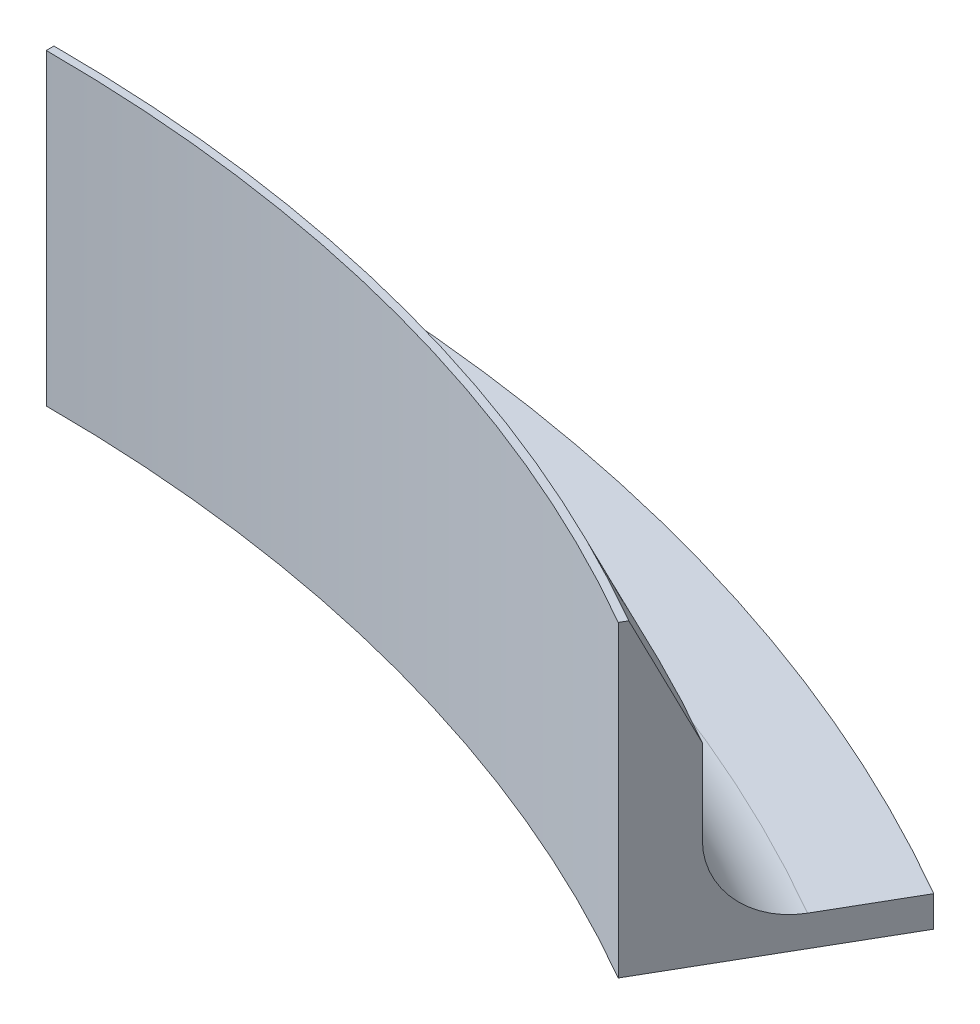
ISO-10303-21;
HEADER;
FILE_DESCRIPTION(('STEP AP214'),'2;1');
FILE_NAME('part.step','',(''),(''),'','','');
FILE_SCHEMA(('AUTOMOTIVE_DESIGN { 1 0 10303 214 1 1 1 1 }'));
ENDSEC;
DATA;
#1=APPLICATION_CONTEXT('core data for automotive mechanical design processes');
#2=APPLICATION_PROTOCOL_DEFINITION('international standard','automotive_design',2000,#1);
#3=PRODUCT_CONTEXT('',#1,'mechanical');
#4=PRODUCT('Part','Part','',(#3));
#5=PRODUCT_RELATED_PRODUCT_CATEGORY('part','',(#4));
#6=PRODUCT_DEFINITION_FORMATION('','',#4);
#7=PRODUCT_DEFINITION_CONTEXT('part definition',#1,'design');
#8=PRODUCT_DEFINITION('design','',#6,#7);
#9=PRODUCT_DEFINITION_SHAPE('','',#8);
#10=(LENGTH_UNIT() NAMED_UNIT(*) SI_UNIT(.MILLI.,.METRE.));
#11=(NAMED_UNIT(*) PLANE_ANGLE_UNIT() SI_UNIT($,.RADIAN.));
#12=(NAMED_UNIT(*) SI_UNIT($,.STERADIAN.) SOLID_ANGLE_UNIT());
#13=UNCERTAINTY_MEASURE_WITH_UNIT(LENGTH_MEASURE(1.E-05),#10,'distance_accuracy_value','');
#14=(GEOMETRIC_REPRESENTATION_CONTEXT(3) GLOBAL_UNCERTAINTY_ASSIGNED_CONTEXT((#13)) GLOBAL_UNIT_ASSIGNED_CONTEXT((#10,
#11,#12)) REPRESENTATION_CONTEXT('',''));
#15=CARTESIAN_POINT('',(0.,0.,0.));
#16=DIRECTION('',(0.,0.,1.));
#17=DIRECTION('',(1.,0.,0.));
#18=AXIS2_PLACEMENT_3D('',#15,#16,#17);
#19=CARTESIAN_POINT('',(0.,2.,0.));
#20=DIRECTION('',(1.,0.,0.));
#21=DIRECTION('',(0.,0.,-1.));
#22=AXIS2_PLACEMENT_3D('',#19,#20,#21);
#23=PLANE('',#22);
#24=DIRECTION('',(0.,0.,1.));
#25=VECTOR('',#24,1.);
#26=CARTESIAN_POINT('',(0.,20.,0.));
#27=LINE('',#26,#25);
#28=CARTESIAN_POINT('',(0.,20.,-102.));
#29=VERTEX_POINT('',#28);
#30=CARTESIAN_POINT('',(0.,20.,-101.5));
#31=VERTEX_POINT('',#30);
#32=EDGE_CURVE('E94',#29,#31,#27,.T.);
#33=ORIENTED_EDGE('',*,*,#32,.F.);
#34=DIRECTION('',(0.,0.906307787036648,0.422618261740704));
#35=VECTOR('',#34,1.);
#36=CARTESIAN_POINT('',(0.,238.739705891972,0.));
#37=LINE('',#36,#35);
#38=CARTESIAN_POINT('',(0.,12.4942257782169,-105.5));
#39=VERTEX_POINT('',#38);
#40=EDGE_CURVE('E11',#29,#39,#37,.F.);
#41=ORIENTED_EDGE('',*,*,#40,.T.);
#42=DIRECTION('',(0.,-1.,0.));
#43=VECTOR('',#42,1.);
#44=CARTESIAN_POINT('',(0.,20.,-105.5));
#45=LINE('',#44,#43);
#46=CARTESIAN_POINT('',(0.,7.,-105.5));
#47=VERTEX_POINT('',#46);
#48=EDGE_CURVE('E111',#39,#47,#45,.T.);
#49=ORIENTED_EDGE('',*,*,#48,.T.);
#50=CARTESIAN_POINT('',(0.,7.,-110.5));
#51=DIRECTION('',(1.,0.,0.));
#52=DIRECTION('',(0.,0.,-1.));
#53=AXIS2_PLACEMENT_3D('',#50,#51,#52);
#54=CIRCLE('',#53,5.);
#55=CARTESIAN_POINT('',(0.,2.,-110.5));
#56=VERTEX_POINT('',#55);
#57=EDGE_CURVE('E153',#47,#56,#54,.T.);
#58=ORIENTED_EDGE('',*,*,#57,.T.);
#59=DIRECTION('',(0.,0.,1.));
#60=VECTOR('',#59,1.);
#61=CARTESIAN_POINT('',(0.,2.,0.));
#62=LINE('',#61,#60);
#63=CARTESIAN_POINT('',(0.,2.,-116.5));
#64=VERTEX_POINT('',#63);
#65=EDGE_CURVE('E125',#64,#56,#62,.T.);
#66=ORIENTED_EDGE('',*,*,#65,.F.);
#67=DIRECTION('',(0.,-1.,0.));
#68=VECTOR('',#67,1.);
#69=CARTESIAN_POINT('',(0.,2.,-116.5));
#70=LINE('',#69,#68);
#71=CARTESIAN_POINT('',(0.,0.,-116.5));
#72=VERTEX_POINT('',#71);
#73=EDGE_CURVE('E134',#64,#72,#70,.T.);
#74=ORIENTED_EDGE('',*,*,#73,.T.);
#75=DIRECTION('',(0.,0.,1.));
#76=VECTOR('',#75,1.);
#77=CARTESIAN_POINT('',(0.,0.,0.));
#78=LINE('',#77,#76);
#79=CARTESIAN_POINT('',(0.,0.,-101.5));
#80=VERTEX_POINT('',#79);
#81=EDGE_CURVE('E107',#72,#80,#78,.T.);
#82=ORIENTED_EDGE('',*,*,#81,.T.);
#83=DIRECTION('',(0.,-1.,0.));
#84=VECTOR('',#83,1.);
#85=CARTESIAN_POINT('',(0.,20.,-101.5));
#86=LINE('',#85,#84);
#87=EDGE_CURVE('E105',#31,#80,#86,.T.);
#88=ORIENTED_EDGE('',*,*,#87,.F.);
#89=EDGE_LOOP('',(#33,#41,#49,#58,#66,#74,#82,#88));
#90=FACE_BOUND('',#89,.T.);
#91=ADVANCED_FACE('F33',(#90),#23,.F.);
#92=CARTESIAN_POINT('',(0.,2.,0.));
#93=DIRECTION('',(-0.866025403784439,0.,-0.5));
#94=DIRECTION('',(-0.5,0.,0.866025403784439));
#95=AXIS2_PLACEMENT_3D('',#92,#93,#94);
#96=PLANE('',#95);
#97=DIRECTION('',(0.,-1.,0.));
#98=VECTOR('',#97,1.);
#99=CARTESIAN_POINT('',(52.75,20.,-91.3656800992583));
#100=LINE('',#99,#98);
#101=CARTESIAN_POINT('',(52.75,12.4942257782167,-91.3656800992582));
#102=VERTEX_POINT('',#101);
#103=CARTESIAN_POINT('',(52.75,7.,-91.3656800992583));
#104=VERTEX_POINT('',#103);
#105=EDGE_CURVE('E118',#102,#104,#100,.T.);
#106=ORIENTED_EDGE('',*,*,#105,.F.);
#107=DIRECTION('',(0.211309130870352,-0.906307787036648,-0.36599815077067));
#108=VECTOR('',#107,1.);
#109=CARTESIAN_POINT('',(0.,238.739705891972,0.));
#110=LINE('',#109,#108);
#111=CARTESIAN_POINT('',(51.,20.,-88.3345911860127));
#112=VERTEX_POINT('',#111);
#113=EDGE_CURVE('E55',#102,#112,#110,.F.);
#114=ORIENTED_EDGE('',*,*,#113,.T.);
#115=DIRECTION('',(0.5,0.,-0.866025403784439));
#116=VECTOR('',#115,1.);
#117=CARTESIAN_POINT('',(0.,20.,0.));
#118=LINE('',#117,#116);
#119=CARTESIAN_POINT('',(50.75,20.,-87.9015784841205));
#120=VERTEX_POINT('',#119);
#121=EDGE_CURVE('E116',#120,#112,#118,.T.);
#122=ORIENTED_EDGE('',*,*,#121,.F.);
#123=DIRECTION('',(0.,-1.,0.));
#124=VECTOR('',#123,1.);
#125=CARTESIAN_POINT('',(50.75,20.,-87.9015784841205));
#126=LINE('',#125,#124);
#127=CARTESIAN_POINT('',(50.75,0.,-87.9015784841205));
#128=VERTEX_POINT('',#127);
#129=EDGE_CURVE('E112',#120,#128,#126,.T.);
#130=ORIENTED_EDGE('',*,*,#129,.T.);
#131=DIRECTION('',(0.5,0.,-0.866025403784439));
#132=VECTOR('',#131,1.);
#133=CARTESIAN_POINT('',(0.,0.,0.));
#134=LINE('',#133,#132);
#135=CARTESIAN_POINT('',(58.25,0.,-100.891959540887));
#136=VERTEX_POINT('',#135);
#137=EDGE_CURVE('E136',#128,#136,#134,.T.);
#138=ORIENTED_EDGE('',*,*,#137,.T.);
#139=DIRECTION('',(0.,-1.,0.));
#140=VECTOR('',#139,1.);
#141=CARTESIAN_POINT('',(58.25,2.,-100.891959540887));
#142=LINE('',#141,#140);
#143=CARTESIAN_POINT('',(58.25,2.,-100.891959540887));
#144=VERTEX_POINT('',#143);
#145=EDGE_CURVE('E142',#144,#136,#142,.T.);
#146=ORIENTED_EDGE('',*,*,#145,.F.);
#147=DIRECTION('',(0.5,0.,-0.866025403784439));
#148=VECTOR('',#147,1.);
#149=CARTESIAN_POINT('',(0.,2.,0.));
#150=LINE('',#149,#148);
#151=CARTESIAN_POINT('',(55.25,2.,-95.6958071181805));
#152=VERTEX_POINT('',#151);
#153=EDGE_CURVE('E128',#152,#144,#150,.T.);
#154=ORIENTED_EDGE('',*,*,#153,.F.);
#155=CARTESIAN_POINT('',(55.25,7.,-95.6958071181805));
#156=DIRECTION('',(-0.866025403784439,0.,-0.5));
#157=DIRECTION('',(-0.5,0.,0.866025403784439));
#158=AXIS2_PLACEMENT_3D('',#155,#156,#157);
#159=CIRCLE('',#158,5.);
#160=EDGE_CURVE('E150',#152,#104,#159,.T.);
#161=ORIENTED_EDGE('',*,*,#160,.T.);
#162=EDGE_LOOP('',(#106,#114,#122,#130,#138,#146,#154,#161));
#163=FACE_BOUND('',#162,.T.);
#164=ADVANCED_FACE('F163',(#163),#96,.F.);
#165=CARTESIAN_POINT('',(0.,2.,0.));
#166=DIRECTION('',(0.,-1.,0.));
#167=DIRECTION('',(0.,0.,-1.));
#168=AXIS2_PLACEMENT_3D('',#165,#166,#167);
#169=CYLINDRICAL_SURFACE('',#168,116.5);
#170=CARTESIAN_POINT('',(0.,0.,0.));
#171=DIRECTION('',(0.,1.,0.));
#172=DIRECTION('',(0.,0.,1.));
#173=AXIS2_PLACEMENT_3D('',#170,#171,#172);
#174=CIRCLE('',#173,116.5);
#175=EDGE_CURVE('E129',#72,#136,#174,.F.);
#176=ORIENTED_EDGE('',*,*,#175,.F.);
#177=ORIENTED_EDGE('',*,*,#73,.F.);
#178=CARTESIAN_POINT('',(0.,2.,0.));
#179=DIRECTION('',(0.,1.,0.));
#180=DIRECTION('',(0.,0.,1.));
#181=AXIS2_PLACEMENT_3D('',#178,#179,#180);
#182=CIRCLE('',#181,116.5);
#183=EDGE_CURVE('E131',#64,#144,#182,.F.);
#184=ORIENTED_EDGE('',*,*,#183,.T.);
#185=ORIENTED_EDGE('',*,*,#145,.T.);
#186=EDGE_LOOP('',(#176,#177,#184,#185));
#187=FACE_BOUND('',#186,.T.);
#188=ADVANCED_FACE('F177',(#187),#169,.T.);
#189=CARTESIAN_POINT('',(0.,2.,0.));
#190=DIRECTION('',(0.,1.,0.));
#191=DIRECTION('',(0.,0.,1.));
#192=AXIS2_PLACEMENT_3D('',#189,#190,#191);
#193=PLANE('',#192);
#194=ORIENTED_EDGE('',*,*,#65,.T.);
#195=CARTESIAN_POINT('',(0.,2.,0.));
#196=DIRECTION('',(0.,1.,0.));
#197=DIRECTION('',(0.,0.,1.));
#198=AXIS2_PLACEMENT_3D('',#195,#196,#197);
#199=CIRCLE('',#198,110.5);
#200=EDGE_CURVE('E144',#56,#152,#199,.F.);
#201=ORIENTED_EDGE('',*,*,#200,.T.);
#202=ORIENTED_EDGE('',*,*,#153,.T.);
#203=ORIENTED_EDGE('',*,*,#183,.F.);
#204=EDGE_LOOP('',(#194,#201,#202,#203));
#205=FACE_BOUND('',#204,.T.);
#206=ADVANCED_FACE('F174',(#205),#193,.T.);
#207=CARTESIAN_POINT('',(0.,0.,0.));
#208=DIRECTION('',(0.,1.,0.));
#209=DIRECTION('',(0.,0.,1.));
#210=AXIS2_PLACEMENT_3D('',#207,#208,#209);
#211=PLANE('',#210);
#212=ORIENTED_EDGE('',*,*,#81,.F.);
#213=ORIENTED_EDGE('',*,*,#175,.T.);
#214=ORIENTED_EDGE('',*,*,#137,.F.);
#215=CARTESIAN_POINT('',(0.,0.,0.));
#216=DIRECTION('',(0.,1.,0.));
#217=DIRECTION('',(0.,0.,1.));
#218=AXIS2_PLACEMENT_3D('',#215,#216,#217);
#219=CIRCLE('',#218,101.5);
#220=EDGE_CURVE('E102',#80,#128,#219,.F.);
#221=ORIENTED_EDGE('',*,*,#220,.F.);
#222=EDGE_LOOP('',(#212,#213,#214,#221));
#223=FACE_BOUND('',#222,.T.);
#224=ADVANCED_FACE('F179',(#223),#211,.F.);
#225=CARTESIAN_POINT('',(0.,20.,0.));
#226=DIRECTION('',(0.,-1.,0.));
#227=DIRECTION('',(0.,0.,-1.));
#228=AXIS2_PLACEMENT_3D('',#225,#226,#227);
#229=CYLINDRICAL_SURFACE('',#228,105.5);
#230=ORIENTED_EDGE('',*,*,#48,.F.);
#231=CARTESIAN_POINT('',(0.,12.4942257782166,0.));
#232=DIRECTION('',(0.,1.,0.));
#233=DIRECTION('',(0.,0.,1.));
#234=AXIS2_PLACEMENT_3D('',#231,#232,#233);
#235=CIRCLE('',#234,105.5);
#236=EDGE_CURVE('E155',#39,#102,#235,.F.);
#237=ORIENTED_EDGE('',*,*,#236,.T.);
#238=ORIENTED_EDGE('',*,*,#105,.T.);
#239=CARTESIAN_POINT('',(0.,7.,0.));
#240=DIRECTION('',(0.,1.,0.));
#241=DIRECTION('',(0.,0.,1.));
#242=AXIS2_PLACEMENT_3D('',#239,#240,#241);
#243=CIRCLE('',#242,105.5);
#244=EDGE_CURVE('E147',#104,#47,#243,.T.);
#245=ORIENTED_EDGE('',*,*,#244,.T.);
#246=EDGE_LOOP('',(#230,#237,#238,#245));
#247=FACE_BOUND('',#246,.T.);
#248=ADVANCED_FACE('F161',(#247),#229,.T.);
#249=CARTESIAN_POINT('',(0.,20.,0.));
#250=DIRECTION('',(0.,-1.,0.));
#251=DIRECTION('',(0.,0.,-1.));
#252=AXIS2_PLACEMENT_3D('',#249,#250,#251);
#253=CYLINDRICAL_SURFACE('',#252,101.5);
#254=ORIENTED_EDGE('',*,*,#220,.T.);
#255=ORIENTED_EDGE('',*,*,#129,.F.);
#256=CARTESIAN_POINT('',(0.,20.,0.));
#257=DIRECTION('',(0.,1.,0.));
#258=DIRECTION('',(0.,0.,1.));
#259=AXIS2_PLACEMENT_3D('',#256,#257,#258);
#260=CIRCLE('',#259,101.5);
#261=EDGE_CURVE('E98',#31,#120,#260,.F.);
#262=ORIENTED_EDGE('',*,*,#261,.F.);
#263=ORIENTED_EDGE('',*,*,#87,.T.);
#264=EDGE_LOOP('',(#254,#255,#262,#263));
#265=FACE_BOUND('',#264,.T.);
#266=ADVANCED_FACE('F114',(#265),#253,.F.);
#267=CARTESIAN_POINT('',(0.,20.,0.));
#268=DIRECTION('',(0.,1.,0.));
#269=DIRECTION('',(0.,0.,1.));
#270=AXIS2_PLACEMENT_3D('',#267,#268,#269);
#271=PLANE('',#270);
#272=ORIENTED_EDGE('',*,*,#121,.T.);
#273=CARTESIAN_POINT('',(0.,20.,0.));
#274=DIRECTION('',(0.,1.,0.));
#275=DIRECTION('',(0.,0.,1.));
#276=AXIS2_PLACEMENT_3D('',#273,#274,#275);
#277=CIRCLE('',#276,102.);
#278=EDGE_CURVE('E41',#112,#29,#277,.T.);
#279=ORIENTED_EDGE('',*,*,#278,.T.);
#280=ORIENTED_EDGE('',*,*,#32,.T.);
#281=ORIENTED_EDGE('',*,*,#261,.T.);
#282=EDGE_LOOP('',(#272,#279,#280,#281));
#283=FACE_BOUND('',#282,.T.);
#284=ADVANCED_FACE('F96',(#283),#271,.T.);
#285=CARTESIAN_POINT('',(0.,7.,0.));
#286=DIRECTION('',(0.,1.,0.));
#287=DIRECTION('',(0.,0.,1.));
#288=AXIS2_PLACEMENT_3D('',#285,#286,#287);
#289=TOROIDAL_SURFACE('',#288,110.5,5.);
#290=ORIENTED_EDGE('',*,*,#57,.F.);
#291=ORIENTED_EDGE('',*,*,#244,.F.);
#292=ORIENTED_EDGE('',*,*,#160,.F.);
#293=ORIENTED_EDGE('',*,*,#200,.F.);
#294=EDGE_LOOP('',(#290,#291,#292,#293));
#295=FACE_BOUND('',#294,.T.);
#296=ADVANCED_FACE('F170',(#295),#289,.F.);
#297=CARTESIAN_POINT('',(0.,12.4942257782166,0.));
#298=DIRECTION('',(0.,-1.,0.));
#299=DIRECTION('',(0.,0.,-1.));
#300=AXIS2_PLACEMENT_3D('',#297,#298,#299);
#301=CONICAL_SURFACE('',#300,105.5,0.436332312998587);
#302=ORIENTED_EDGE('',*,*,#40,.F.);
#303=ORIENTED_EDGE('',*,*,#278,.F.);
#304=ORIENTED_EDGE('',*,*,#113,.F.);
#305=ORIENTED_EDGE('',*,*,#236,.F.);
#306=EDGE_LOOP('',(#302,#303,#304,#305));
#307=FACE_BOUND('',#306,.T.);
#308=ADVANCED_FACE('F35',(#307),#301,.T.);
#309=CLOSED_SHELL('',(#91,#164,#188,#206,#224,#248,#266,#284,#296,#308));
#310=MANIFOLD_SOLID_BREP('B2',#309);
#311=ADVANCED_BREP_SHAPE_REPRESENTATION('',(#18,#310),#14);
#312=SHAPE_DEFINITION_REPRESENTATION(#9,#311);
ENDSEC;
END-ISO-10303-21;
